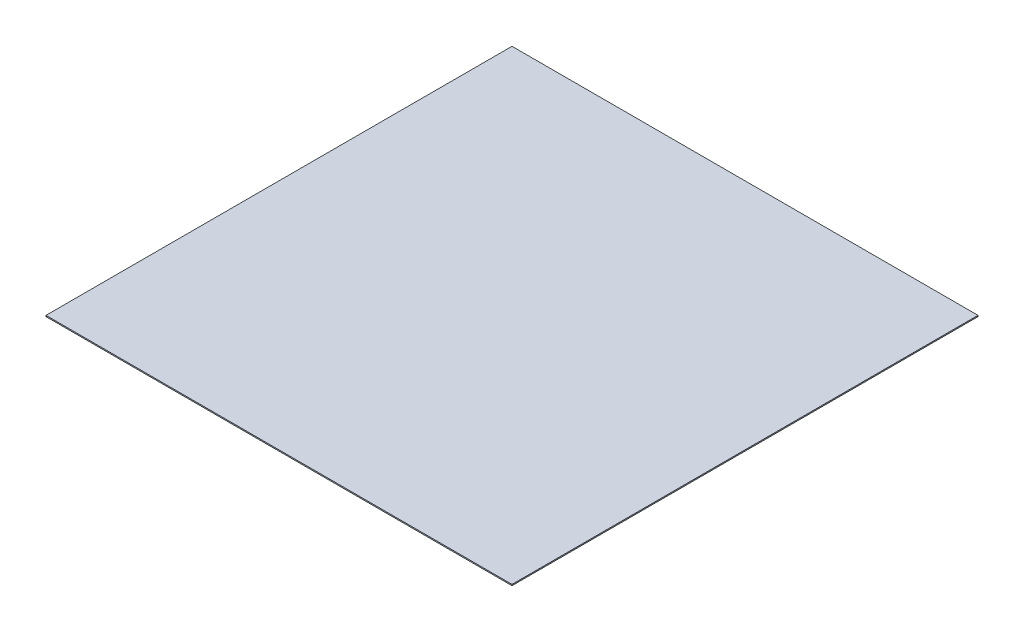
ISO-10303-21;
HEADER;
FILE_DESCRIPTION(('STEP AP214'),'2;1');
FILE_NAME('part.step','',(''),(''),'','','');
FILE_SCHEMA(('AUTOMOTIVE_DESIGN { 1 0 10303 214 1 1 1 1 }'));
ENDSEC;
DATA;
#1=APPLICATION_CONTEXT('core data for automotive mechanical design processes');
#2=APPLICATION_PROTOCOL_DEFINITION('international standard','automotive_design',2000,#1);
#3=PRODUCT_CONTEXT('',#1,'mechanical');
#4=PRODUCT('Part','Part','',(#3));
#5=PRODUCT_RELATED_PRODUCT_CATEGORY('part','',(#4));
#6=PRODUCT_DEFINITION_FORMATION('','',#4);
#7=PRODUCT_DEFINITION_CONTEXT('part definition',#1,'design');
#8=PRODUCT_DEFINITION('design','',#6,#7);
#9=PRODUCT_DEFINITION_SHAPE('','',#8);
#10=(LENGTH_UNIT() NAMED_UNIT(*) SI_UNIT(.MILLI.,.METRE.));
#11=(NAMED_UNIT(*) PLANE_ANGLE_UNIT() SI_UNIT($,.RADIAN.));
#12=(NAMED_UNIT(*) SI_UNIT($,.STERADIAN.) SOLID_ANGLE_UNIT());
#13=UNCERTAINTY_MEASURE_WITH_UNIT(LENGTH_MEASURE(1.E-05),#10,'distance_accuracy_value','');
#14=(GEOMETRIC_REPRESENTATION_CONTEXT(3) GLOBAL_UNCERTAINTY_ASSIGNED_CONTEXT((#13)) GLOBAL_UNIT_ASSIGNED_CONTEXT((#10,
#11,#12)) REPRESENTATION_CONTEXT('',''));
#15=CARTESIAN_POINT('',(0.,0.,0.));
#16=DIRECTION('',(0.,0.,1.));
#17=DIRECTION('',(1.,0.,0.));
#18=AXIS2_PLACEMENT_3D('',#15,#16,#17);
#19=CARTESIAN_POINT('',(-200.,1.,200.));
#20=DIRECTION('',(1.,0.,0.));
#21=DIRECTION('',(0.,0.,-1.));
#22=AXIS2_PLACEMENT_3D('',#19,#20,#21);
#23=PLANE('',#22);
#24=DIRECTION('',(0.,0.,1.));
#25=VECTOR('',#24,1.);
#26=CARTESIAN_POINT('',(-200.,0.,200.));
#27=LINE('',#26,#25);
#28=CARTESIAN_POINT('',(-200.,0.,-200.));
#29=VERTEX_POINT('',#28);
#30=CARTESIAN_POINT('',(-200.,0.,200.));
#31=VERTEX_POINT('',#30);
#32=EDGE_CURVE('E101',#29,#31,#27,.T.);
#33=ORIENTED_EDGE('',*,*,#32,.T.);
#34=DIRECTION('',(0.,-1.,0.));
#35=VECTOR('',#34,1.);
#36=CARTESIAN_POINT('',(-200.,1.,200.));
#37=LINE('',#36,#35);
#38=CARTESIAN_POINT('',(-200.,1.,200.));
#39=VERTEX_POINT('',#38);
#40=EDGE_CURVE('E11',#39,#31,#37,.T.);
#41=ORIENTED_EDGE('',*,*,#40,.F.);
#42=DIRECTION('',(0.,0.,1.));
#43=VECTOR('',#42,1.);
#44=CARTESIAN_POINT('',(-200.,1.,200.));
#45=LINE('',#44,#43);
#46=CARTESIAN_POINT('',(-200.,1.,-200.));
#47=VERTEX_POINT('',#46);
#48=EDGE_CURVE('E89',#47,#39,#45,.T.);
#49=ORIENTED_EDGE('',*,*,#48,.F.);
#50=DIRECTION('',(0.,-1.,0.));
#51=VECTOR('',#50,1.);
#52=CARTESIAN_POINT('',(-200.,1.,-200.));
#53=LINE('',#52,#51);
#54=EDGE_CURVE('E97',#47,#29,#53,.T.);
#55=ORIENTED_EDGE('',*,*,#54,.T.);
#56=EDGE_LOOP('',(#33,#41,#49,#55));
#57=FACE_BOUND('',#56,.T.);
#58=ADVANCED_FACE('F38',(#57),#23,.F.);
#59=CARTESIAN_POINT('',(200.,1.,200.));
#60=DIRECTION('',(0.,0.,-1.));
#61=DIRECTION('',(-1.,0.,0.));
#62=AXIS2_PLACEMENT_3D('',#59,#60,#61);
#63=PLANE('',#62);
#64=DIRECTION('',(1.,0.,0.));
#65=VECTOR('',#64,1.);
#66=CARTESIAN_POINT('',(200.,0.,200.));
#67=LINE('',#66,#65);
#68=CARTESIAN_POINT('',(200.,0.,200.));
#69=VERTEX_POINT('',#68);
#70=EDGE_CURVE('E93',#31,#69,#67,.T.);
#71=ORIENTED_EDGE('',*,*,#70,.T.);
#72=DIRECTION('',(0.,-1.,0.));
#73=VECTOR('',#72,1.);
#74=CARTESIAN_POINT('',(200.,1.,200.));
#75=LINE('',#74,#73);
#76=CARTESIAN_POINT('',(200.,1.,200.));
#77=VERTEX_POINT('',#76);
#78=EDGE_CURVE('E46',#77,#69,#75,.T.);
#79=ORIENTED_EDGE('',*,*,#78,.F.);
#80=DIRECTION('',(1.,0.,0.));
#81=VECTOR('',#80,1.);
#82=CARTESIAN_POINT('',(200.,1.,200.));
#83=LINE('',#82,#81);
#84=EDGE_CURVE('E84',#39,#77,#83,.T.);
#85=ORIENTED_EDGE('',*,*,#84,.F.);
#86=ORIENTED_EDGE('',*,*,#40,.T.);
#87=EDGE_LOOP('',(#71,#79,#85,#86));
#88=FACE_BOUND('',#87,.T.);
#89=ADVANCED_FACE('F92',(#88),#63,.F.);
#90=CARTESIAN_POINT('',(200.,1.,200.));
#91=DIRECTION('',(-1.,0.,0.));
#92=DIRECTION('',(0.,0.,1.));
#93=AXIS2_PLACEMENT_3D('',#90,#91,#92);
#94=PLANE('',#93);
#95=DIRECTION('',(0.,0.,-1.));
#96=VECTOR('',#95,1.);
#97=CARTESIAN_POINT('',(200.,0.,200.));
#98=LINE('',#97,#96);
#99=CARTESIAN_POINT('',(200.,0.,-200.));
#100=VERTEX_POINT('',#99);
#101=EDGE_CURVE('E71',#69,#100,#98,.T.);
#102=ORIENTED_EDGE('',*,*,#101,.T.);
#103=DIRECTION('',(0.,-1.,0.));
#104=VECTOR('',#103,1.);
#105=CARTESIAN_POINT('',(200.,1.,-200.));
#106=LINE('',#105,#104);
#107=CARTESIAN_POINT('',(200.,1.,-200.));
#108=VERTEX_POINT('',#107);
#109=EDGE_CURVE('E94',#108,#100,#106,.T.);
#110=ORIENTED_EDGE('',*,*,#109,.F.);
#111=DIRECTION('',(0.,0.,-1.));
#112=VECTOR('',#111,1.);
#113=CARTESIAN_POINT('',(200.,1.,200.));
#114=LINE('',#113,#112);
#115=EDGE_CURVE('E87',#77,#108,#114,.T.);
#116=ORIENTED_EDGE('',*,*,#115,.F.);
#117=ORIENTED_EDGE('',*,*,#78,.T.);
#118=EDGE_LOOP('',(#102,#110,#116,#117));
#119=FACE_BOUND('',#118,.T.);
#120=ADVANCED_FACE('F95',(#119),#94,.F.);
#121=CARTESIAN_POINT('',(200.,1.,-200.));
#122=DIRECTION('',(0.,0.,1.));
#123=DIRECTION('',(1.,0.,0.));
#124=AXIS2_PLACEMENT_3D('',#121,#122,#123);
#125=PLANE('',#124);
#126=DIRECTION('',(-1.,0.,0.));
#127=VECTOR('',#126,1.);
#128=CARTESIAN_POINT('',(200.,0.,-200.));
#129=LINE('',#128,#127);
#130=EDGE_CURVE('E77',#100,#29,#129,.T.);
#131=ORIENTED_EDGE('',*,*,#130,.T.);
#132=ORIENTED_EDGE('',*,*,#54,.F.);
#133=DIRECTION('',(-1.,0.,0.));
#134=VECTOR('',#133,1.);
#135=CARTESIAN_POINT('',(200.,1.,-200.));
#136=LINE('',#135,#134);
#137=EDGE_CURVE('E54',#108,#47,#136,.T.);
#138=ORIENTED_EDGE('',*,*,#137,.F.);
#139=ORIENTED_EDGE('',*,*,#109,.T.);
#140=EDGE_LOOP('',(#131,#132,#138,#139));
#141=FACE_BOUND('',#140,.T.);
#142=ADVANCED_FACE('F108',(#141),#125,.F.);
#143=CARTESIAN_POINT('',(0.,1.,0.));
#144=DIRECTION('',(0.,1.,0.));
#145=DIRECTION('',(0.,0.,1.));
#146=AXIS2_PLACEMENT_3D('',#143,#144,#145);
#147=PLANE('',#146);
#148=ORIENTED_EDGE('',*,*,#48,.T.);
#149=ORIENTED_EDGE('',*,*,#84,.T.);
#150=ORIENTED_EDGE('',*,*,#115,.T.);
#151=ORIENTED_EDGE('',*,*,#137,.T.);
#152=EDGE_LOOP('',(#148,#149,#150,#151));
#153=FACE_BOUND('',#152,.T.);
#154=ADVANCED_FACE('F85',(#153),#147,.T.);
#155=CARTESIAN_POINT('',(0.,0.,0.));
#156=DIRECTION('',(0.,1.,0.));
#157=DIRECTION('',(0.,0.,1.));
#158=AXIS2_PLACEMENT_3D('',#155,#156,#157);
#159=PLANE('',#158);
#160=ORIENTED_EDGE('',*,*,#32,.F.);
#161=ORIENTED_EDGE('',*,*,#130,.F.);
#162=ORIENTED_EDGE('',*,*,#101,.F.);
#163=ORIENTED_EDGE('',*,*,#70,.F.);
#164=EDGE_LOOP('',(#160,#161,#162,#163));
#165=FACE_BOUND('',#164,.T.);
#166=ADVANCED_FACE('F111',(#165),#159,.F.);
#167=CLOSED_SHELL('',(#58,#89,#120,#142,#154,#166));
#168=MANIFOLD_SOLID_BREP('B2',#167);
#169=ADVANCED_BREP_SHAPE_REPRESENTATION('',(#18,#168),#14);
#170=SHAPE_DEFINITION_REPRESENTATION(#9,#169);
ENDSEC;
END-ISO-10303-21;
